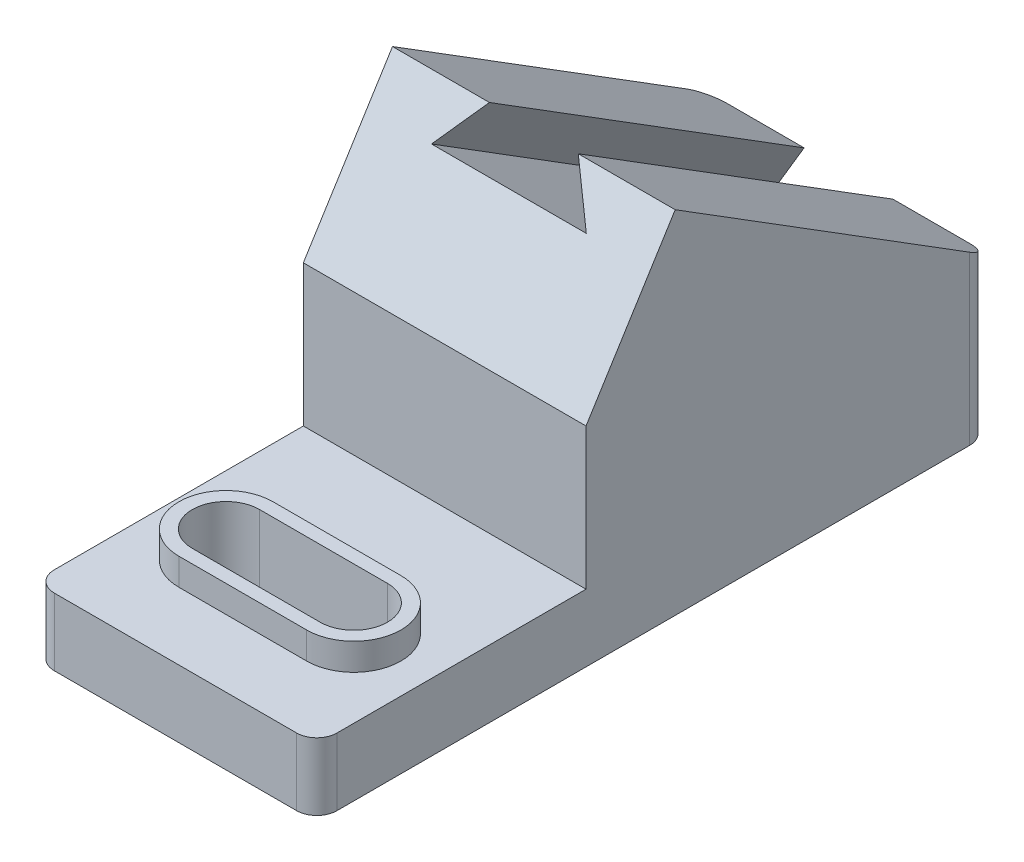
ISO-10303-21;
HEADER;
FILE_DESCRIPTION(('STEP AP214'),'2;1');
FILE_NAME('part.step','',(''),(''),'','','');
FILE_SCHEMA(('AUTOMOTIVE_DESIGN { 1 0 10303 214 1 1 1 1 }'));
ENDSEC;
DATA;
#1=APPLICATION_CONTEXT('core data for automotive mechanical design processes');
#2=APPLICATION_PROTOCOL_DEFINITION('international standard','automotive_design',2000,#1);
#3=PRODUCT_CONTEXT('',#1,'mechanical');
#4=PRODUCT('Part','Part','',(#3));
#5=PRODUCT_RELATED_PRODUCT_CATEGORY('part','',(#4));
#6=PRODUCT_DEFINITION_FORMATION('','',#4);
#7=PRODUCT_DEFINITION_CONTEXT('part definition',#1,'design');
#8=PRODUCT_DEFINITION('design','',#6,#7);
#9=PRODUCT_DEFINITION_SHAPE('','',#8);
#10=(LENGTH_UNIT() NAMED_UNIT(*) SI_UNIT(.MILLI.,.METRE.));
#11=(NAMED_UNIT(*) PLANE_ANGLE_UNIT() SI_UNIT($,.RADIAN.));
#12=(NAMED_UNIT(*) SI_UNIT($,.STERADIAN.) SOLID_ANGLE_UNIT());
#13=UNCERTAINTY_MEASURE_WITH_UNIT(LENGTH_MEASURE(1.E-05),#10,'distance_accuracy_value','');
#14=(GEOMETRIC_REPRESENTATION_CONTEXT(3) GLOBAL_UNCERTAINTY_ASSIGNED_CONTEXT((#13)) GLOBAL_UNIT_ASSIGNED_CONTEXT((#10,
#11,#12)) REPRESENTATION_CONTEXT('',''));
#15=CARTESIAN_POINT('',(0.,0.,0.));
#16=DIRECTION('',(0.,0.,1.));
#17=DIRECTION('',(1.,0.,0.));
#18=AXIS2_PLACEMENT_3D('',#15,#16,#17);
#19=CARTESIAN_POINT('',(21.,22.9872989694927,0.));
#20=DIRECTION('',(0.,-0.848048096156425,0.529919264233206));
#21=DIRECTION('',(0.,-0.529919264233206,-0.848048096156426));
#22=AXIS2_PLACEMENT_3D('',#19,#20,#21);
#23=PLANE('',#22);
#24=DIRECTION('',(-1.,0.,0.));
#25=VECTOR('',#24,1.);
#26=CARTESIAN_POINT('',(21.,22.9872989694927,0.));
#27=LINE('',#26,#25);
#28=CARTESIAN_POINT('',(-6.59854723253198,22.9872989694927,0.));
#29=VERTEX_POINT('',#28);
#30=CARTESIAN_POINT('',(-18.,22.9872989694927,0.));
#31=VERTEX_POINT('',#30);
#32=EDGE_CURVE('E229',#29,#31,#27,.T.);
#33=ORIENTED_EDGE('',*,*,#32,.T.);
#34=CARTESIAN_POINT('',(-18.,24.8619070252207,3.));
#35=DIRECTION('',(0.,-0.848048096156425,0.529919264233206));
#36=DIRECTION('',(0.,0.529919264233206,0.848048096156426));
#37=AXIS2_PLACEMENT_3D('',#34,#35,#36);
#38=ELLIPSE('',#37,3.53753521008629,3.);
#39=CARTESIAN_POINT('',(-21.,24.8619070252207,3.));
#40=VERTEX_POINT('',#39);
#41=EDGE_CURVE('E241',#31,#40,#38,.F.);
#42=ORIENTED_EDGE('',*,*,#41,.T.);
#43=DIRECTION('',(0.,0.529919264233206,0.848048096156426));
#44=VECTOR('',#43,1.);
#45=CARTESIAN_POINT('',(-21.,22.9872989694927,0.));
#46=LINE('',#45,#44);
#47=CARTESIAN_POINT('',(-21.,52.2012024039106,46.7520183941699));
#48=VERTEX_POINT('',#47);
#49=EDGE_CURVE('E222',#40,#48,#46,.T.);
#50=ORIENTED_EDGE('',*,*,#49,.T.);
#51=DIRECTION('',(-1.,0.,0.));
#52=VECTOR('',#51,1.);
#53=CARTESIAN_POINT('',(21.,52.2012024039106,46.7520183941699));
#54=LINE('',#53,#52);
#55=CARTESIAN_POINT('',(-6.59854723253198,52.2012024039107,46.7520183941699));
#56=VERTEX_POINT('',#55);
#57=EDGE_CURVE('E212',#56,#48,#54,.T.);
#58=ORIENTED_EDGE('',*,*,#57,.F.);
#59=DIRECTION('',(0.,0.529919264233205,0.848048096156426));
#60=VECTOR('',#59,1.);
#61=CARTESIAN_POINT('',(-6.59854723253198,7.94684225197886,-24.0697622175849));
#62=LINE('',#61,#60);
#63=EDGE_CURVE('E194',#29,#56,#62,.T.);
#64=ORIENTED_EDGE('',*,*,#63,.F.);
#65=EDGE_LOOP('',(#33,#42,#50,#58,#64));
#66=FACE_BOUND('',#65,.T.);
#67=ADVANCED_FACE('F41',(#66),#23,.F.);
#68=CARTESIAN_POINT('',(21.,0.,0.));
#69=DIRECTION('',(0.,0.,1.));
#70=DIRECTION('',(1.,0.,0.));
#71=AXIS2_PLACEMENT_3D('',#68,#69,#70);
#72=PLANE('',#71);
#73=DIRECTION('',(-1.,0.,0.));
#74=VECTOR('',#73,1.);
#75=CARTESIAN_POINT('',(21.,0.,0.));
#76=LINE('',#75,#74);
#77=CARTESIAN_POINT('',(18.,0.,0.));
#78=VERTEX_POINT('',#77);
#79=CARTESIAN_POINT('',(-18.,0.,0.));
#80=VERTEX_POINT('',#79);
#81=EDGE_CURVE('E232',#78,#80,#76,.T.);
#82=ORIENTED_EDGE('',*,*,#81,.T.);
#83=DIRECTION('',(0.,1.,0.));
#84=VECTOR('',#83,1.);
#85=CARTESIAN_POINT('',(-18.,0.,0.));
#86=LINE('',#85,#84);
#87=EDGE_CURVE('E239',#80,#31,#86,.T.);
#88=ORIENTED_EDGE('',*,*,#87,.T.);
#89=ORIENTED_EDGE('',*,*,#32,.F.);
#90=DIRECTION('',(0.51057668670334,0.85983222025872,0.));
#91=VECTOR('',#90,1.);
#92=CARTESIAN_POINT('',(-18.739073495521,2.54215150454311,0.));
#93=LINE('',#92,#91);
#94=CARTESIAN_POINT('',(-11.5,14.7330501459581,0.));
#95=VERTEX_POINT('',#94);
#96=EDGE_CURVE('E205',#95,#29,#93,.T.);
#97=ORIENTED_EDGE('',*,*,#96,.F.);
#98=DIRECTION('',(-1.,0.,0.));
#99=VECTOR('',#98,1.);
#100=CARTESIAN_POINT('',(0.,14.7330501459581,0.));
#101=LINE('',#100,#99);
#102=CARTESIAN_POINT('',(11.5,14.7330501459581,0.));
#103=VERTEX_POINT('',#102);
#104=EDGE_CURVE('E388',#103,#95,#101,.T.);
#105=ORIENTED_EDGE('',*,*,#104,.F.);
#106=DIRECTION('',(0.51057668670334,-0.85983222025872,0.));
#107=VECTOR('',#106,1.);
#108=CARTESIAN_POINT('',(18.739073495521,2.54215150454312,0.));
#109=LINE('',#108,#107);
#110=CARTESIAN_POINT('',(6.59854723253198,22.9872989694927,0.));
#111=VERTEX_POINT('',#110);
#112=EDGE_CURVE('E385',#111,#103,#109,.T.);
#113=ORIENTED_EDGE('',*,*,#112,.F.);
#114=CARTESIAN_POINT('',(18.,22.9872989694927,0.));
#115=VERTEX_POINT('',#114);
#116=EDGE_CURVE('E235',#115,#111,#27,.T.);
#117=ORIENTED_EDGE('',*,*,#116,.F.);
#118=DIRECTION('',(0.,1.,0.));
#119=VECTOR('',#118,1.);
#120=CARTESIAN_POINT('',(18.,0.,0.));
#121=LINE('',#120,#119);
#122=EDGE_CURVE('E240',#115,#78,#121,.F.);
#123=ORIENTED_EDGE('',*,*,#122,.T.);
#124=EDGE_LOOP('',(#82,#88,#89,#97,#105,#113,#117,#123));
#125=FACE_BOUND('',#124,.T.);
#126=ADVANCED_FACE('F399',(#125),#72,.F.);
#127=CARTESIAN_POINT('',(21.,52.2012024039106,46.7520183941699));
#128=DIRECTION('',(0.,-0.529919264233205,-0.848048096156426));
#129=DIRECTION('',(0.,0.848048096156426,-0.529919264233205));
#130=AXIS2_PLACEMENT_3D('',#127,#128,#129);
#131=PLANE('',#130);
#132=DIRECTION('',(-0.57357643635105,-0.694680331621921,0.434084448604747));
#133=VECTOR('',#132,1.);
#134=CARTESIAN_POINT('',(-13.5870330842894,43.7371802416358,52.0409264372568));
#135=LINE('',#134,#133);
#136=CARTESIAN_POINT('',(-11.5,46.2648657308157,50.4614532438023));
#137=VERTEX_POINT('',#136);
#138=EDGE_CURVE('E200',#56,#137,#135,.T.);
#139=ORIENTED_EDGE('',*,*,#138,.F.);
#140=ORIENTED_EDGE('',*,*,#57,.T.);
#141=DIRECTION('',(0.,-0.848048096156426,0.529919264233205));
#142=VECTOR('',#141,1.);
#143=CARTESIAN_POINT('',(-21.,52.2012024039106,46.7520183941699));
#144=LINE('',#143,#142);
#145=CARTESIAN_POINT('',(-21.,31.,60.));
#146=VERTEX_POINT('',#145);
#147=EDGE_CURVE('E306',#48,#146,#144,.T.);
#148=ORIENTED_EDGE('',*,*,#147,.T.);
#149=DIRECTION('',(-1.,0.,0.));
#150=VECTOR('',#149,1.);
#151=CARTESIAN_POINT('',(21.,31.,60.));
#152=LINE('',#151,#150);
#153=CARTESIAN_POINT('',(21.,31.,60.));
#154=VERTEX_POINT('',#153);
#155=EDGE_CURVE('E224',#154,#146,#152,.T.);
#156=ORIENTED_EDGE('',*,*,#155,.F.);
#157=DIRECTION('',(0.,-0.848048096156426,0.529919264233205));
#158=VECTOR('',#157,1.);
#159=CARTESIAN_POINT('',(21.,52.2012024039106,46.7520183941699));
#160=LINE('',#159,#158);
#161=CARTESIAN_POINT('',(21.,52.2012024039106,46.7520183941699));
#162=VERTEX_POINT('',#161);
#163=EDGE_CURVE('E316',#162,#154,#160,.T.);
#164=ORIENTED_EDGE('',*,*,#163,.F.);
#165=CARTESIAN_POINT('',(6.59854723253198,52.2012024039107,46.7520183941699));
#166=VERTEX_POINT('',#165);
#167=EDGE_CURVE('E225',#162,#166,#54,.T.);
#168=ORIENTED_EDGE('',*,*,#167,.T.);
#169=DIRECTION('',(-0.57357643635105,0.694680331621921,-0.434084448604747));
#170=VECTOR('',#169,1.);
#171=CARTESIAN_POINT('',(13.5870330842894,43.7371802416358,52.0409264372568));
#172=LINE('',#171,#170);
#173=CARTESIAN_POINT('',(11.5,46.2648657308157,50.4614532438023));
#174=VERTEX_POINT('',#173);
#175=EDGE_CURVE('E208',#174,#166,#172,.T.);
#176=ORIENTED_EDGE('',*,*,#175,.F.);
#177=DIRECTION('',(1.,0.,0.));
#178=VECTOR('',#177,1.);
#179=CARTESIAN_POINT('',(0.,46.2648657308157,50.4614532438023));
#180=LINE('',#179,#178);
#181=EDGE_CURVE('E217',#137,#174,#180,.T.);
#182=ORIENTED_EDGE('',*,*,#181,.F.);
#183=EDGE_LOOP('',(#139,#140,#148,#156,#164,#168,#176,#182));
#184=FACE_BOUND('',#183,.T.);
#185=ADVANCED_FACE('F213',(#184),#131,.F.);
#186=CARTESIAN_POINT('',(21.,0.,100.));
#187=DIRECTION('',(0.,1.,0.));
#188=DIRECTION('',(0.,0.,1.));
#189=AXIS2_PLACEMENT_3D('',#186,#187,#188);
#190=PLANE('',#189);
#191=DIRECTION('',(0.,0.,-1.));
#192=VECTOR('',#191,1.);
#193=CARTESIAN_POINT('',(-21.,0.,100.));
#194=LINE('',#193,#192);
#195=CARTESIAN_POINT('',(-21.,0.,97.));
#196=VERTEX_POINT('',#195);
#197=CARTESIAN_POINT('',(-21.,0.,3.));
#198=VERTEX_POINT('',#197);
#199=EDGE_CURVE('E315',#196,#198,#194,.T.);
#200=ORIENTED_EDGE('',*,*,#199,.T.);
#201=CARTESIAN_POINT('',(-18.,0.,3.));
#202=DIRECTION('',(0.,1.,0.));
#203=DIRECTION('',(0.,0.,1.));
#204=AXIS2_PLACEMENT_3D('',#201,#202,#203);
#205=CIRCLE('',#204,3.);
#206=EDGE_CURVE('E255',#198,#80,#205,.F.);
#207=ORIENTED_EDGE('',*,*,#206,.T.);
#208=ORIENTED_EDGE('',*,*,#81,.F.);
#209=CARTESIAN_POINT('',(18.,0.,3.));
#210=DIRECTION('',(0.,1.,0.));
#211=DIRECTION('',(0.,0.,1.));
#212=AXIS2_PLACEMENT_3D('',#209,#210,#211);
#213=CIRCLE('',#212,3.);
#214=CARTESIAN_POINT('',(21.,0.,3.));
#215=VERTEX_POINT('',#214);
#216=EDGE_CURVE('E252',#78,#215,#213,.F.);
#217=ORIENTED_EDGE('',*,*,#216,.T.);
#218=DIRECTION('',(0.,0.,-1.));
#219=VECTOR('',#218,1.);
#220=CARTESIAN_POINT('',(21.,0.,100.));
#221=LINE('',#220,#219);
#222=CARTESIAN_POINT('',(21.,0.,97.));
#223=VERTEX_POINT('',#222);
#224=EDGE_CURVE('E289',#223,#215,#221,.T.);
#225=ORIENTED_EDGE('',*,*,#224,.F.);
#226=CARTESIAN_POINT('',(18.,0.,97.));
#227=DIRECTION('',(0.,1.,0.));
#228=DIRECTION('',(0.,0.,1.));
#229=AXIS2_PLACEMENT_3D('',#226,#227,#228);
#230=CIRCLE('',#229,3.);
#231=CARTESIAN_POINT('',(18.,0.,100.));
#232=VERTEX_POINT('',#231);
#233=EDGE_CURVE('E246',#223,#232,#230,.F.);
#234=ORIENTED_EDGE('',*,*,#233,.T.);
#235=DIRECTION('',(-1.,0.,0.));
#236=VECTOR('',#235,1.);
#237=CARTESIAN_POINT('',(21.,0.,100.));
#238=LINE('',#237,#236);
#239=CARTESIAN_POINT('',(-18.,0.,100.));
#240=VERTEX_POINT('',#239);
#241=EDGE_CURVE('E285',#232,#240,#238,.T.);
#242=ORIENTED_EDGE('',*,*,#241,.T.);
#243=CARTESIAN_POINT('',(-18.,0.,97.));
#244=DIRECTION('',(0.,1.,0.));
#245=DIRECTION('',(0.,0.,1.));
#246=AXIS2_PLACEMENT_3D('',#243,#244,#245);
#247=CIRCLE('',#246,3.);
#248=EDGE_CURVE('E249',#240,#196,#247,.F.);
#249=ORIENTED_EDGE('',*,*,#248,.T.);
#250=EDGE_LOOP('',(#200,#207,#208,#217,#225,#234,#242,#249));
#251=FACE_BOUND('',#250,.T.);
#252=DIRECTION('',(1.,0.,0.));
#253=VECTOR('',#252,1.);
#254=CARTESIAN_POINT('',(0.,0.,78.));
#255=LINE('',#254,#253);
#256=CARTESIAN_POINT('',(-9.5,0.,78.));
#257=VERTEX_POINT('',#256);
#258=CARTESIAN_POINT('',(9.5,0.,78.));
#259=VERTEX_POINT('',#258);
#260=EDGE_CURVE('E377',#257,#259,#255,.T.);
#261=ORIENTED_EDGE('',*,*,#260,.F.);
#262=CARTESIAN_POINT('',(-9.5,0.,83.));
#263=DIRECTION('',(0.,1.,0.));
#264=DIRECTION('',(0.,0.,1.));
#265=AXIS2_PLACEMENT_3D('',#262,#263,#264);
#266=CIRCLE('',#265,5.);
#267=CARTESIAN_POINT('',(-9.5,0.,88.));
#268=VERTEX_POINT('',#267);
#269=EDGE_CURVE('E376',#257,#268,#266,.T.);
#270=ORIENTED_EDGE('',*,*,#269,.T.);
#271=DIRECTION('',(1.,0.,0.));
#272=VECTOR('',#271,1.);
#273=CARTESIAN_POINT('',(0.,0.,88.));
#274=LINE('',#273,#272);
#275=CARTESIAN_POINT('',(9.5,0.,88.));
#276=VERTEX_POINT('',#275);
#277=EDGE_CURVE('E373',#268,#276,#274,.T.);
#278=ORIENTED_EDGE('',*,*,#277,.T.);
#279=CARTESIAN_POINT('',(9.5,0.,83.));
#280=DIRECTION('',(0.,1.,0.));
#281=DIRECTION('',(0.,0.,1.));
#282=AXIS2_PLACEMENT_3D('',#279,#280,#281);
#283=CIRCLE('',#282,5.);
#284=EDGE_CURVE('E354',#276,#259,#283,.T.);
#285=ORIENTED_EDGE('',*,*,#284,.T.);
#286=EDGE_LOOP('',(#261,#270,#278,#285));
#287=FACE_BOUND('',#286,.T.);
#288=ADVANCED_FACE('F286',(#251,#287),#190,.F.);
#289=DIRECTION('',(0.,0.529919264233206,0.848048096156426));
#290=VECTOR('',#289,1.);
#291=CARTESIAN_POINT('',(21.,22.9872989694927,0.));
#292=LINE('',#291,#290);
#293=CARTESIAN_POINT('',(21.,24.8619070252207,3.));
#294=VERTEX_POINT('',#293);
#295=EDGE_CURVE('E308',#294,#162,#292,.T.);
#296=ORIENTED_EDGE('',*,*,#295,.F.);
#297=CARTESIAN_POINT('',(18.,24.8619070252207,3.));
#298=DIRECTION('',(0.,-0.848048096156425,0.529919264233206));
#299=DIRECTION('',(0.,-0.529919264233206,-0.848048096156426));
#300=AXIS2_PLACEMENT_3D('',#297,#298,#299);
#301=ELLIPSE('',#300,3.53753521008629,3.);
#302=EDGE_CURVE('E265',#294,#115,#301,.F.);
#303=ORIENTED_EDGE('',*,*,#302,.T.);
#304=ORIENTED_EDGE('',*,*,#116,.T.);
#305=DIRECTION('',(0.,0.529919264233205,0.848048096156426));
#306=VECTOR('',#305,1.);
#307=CARTESIAN_POINT('',(6.59854723253198,7.94684225197886,-24.0697622175849));
#308=LINE('',#307,#306);
#309=EDGE_CURVE('E390',#111,#166,#308,.T.);
#310=ORIENTED_EDGE('',*,*,#309,.T.);
#311=ORIENTED_EDGE('',*,*,#167,.F.);
#312=EDGE_LOOP('',(#296,#303,#304,#310,#311));
#313=FACE_BOUND('',#312,.T.);
#314=ADVANCED_FACE('F418',(#313),#23,.F.);
#315=CARTESIAN_POINT('',(21.,31.,60.));
#316=DIRECTION('',(0.,0.,-1.));
#317=DIRECTION('',(-1.,0.,0.));
#318=AXIS2_PLACEMENT_3D('',#315,#316,#317);
#319=PLANE('',#318);
#320=DIRECTION('',(0.,-1.,0.));
#321=VECTOR('',#320,1.);
#322=CARTESIAN_POINT('',(-21.,31.,60.));
#323=LINE('',#322,#321);
#324=CARTESIAN_POINT('',(-21.,10.,60.));
#325=VERTEX_POINT('',#324);
#326=EDGE_CURVE('E301',#146,#325,#323,.T.);
#327=ORIENTED_EDGE('',*,*,#326,.T.);
#328=DIRECTION('',(-1.,0.,0.));
#329=VECTOR('',#328,1.);
#330=CARTESIAN_POINT('',(21.,10.,60.));
#331=LINE('',#330,#329);
#332=CARTESIAN_POINT('',(21.,10.,60.));
#333=VERTEX_POINT('',#332);
#334=EDGE_CURVE('E230',#333,#325,#331,.T.);
#335=ORIENTED_EDGE('',*,*,#334,.F.);
#336=DIRECTION('',(0.,-1.,0.));
#337=VECTOR('',#336,1.);
#338=CARTESIAN_POINT('',(21.,31.,60.));
#339=LINE('',#338,#337);
#340=EDGE_CURVE('E284',#154,#333,#339,.T.);
#341=ORIENTED_EDGE('',*,*,#340,.F.);
#342=ORIENTED_EDGE('',*,*,#155,.T.);
#343=EDGE_LOOP('',(#327,#335,#341,#342));
#344=FACE_BOUND('',#343,.T.);
#345=ADVANCED_FACE('F419',(#344),#319,.F.);
#346=CARTESIAN_POINT('',(21.,10.,60.));
#347=DIRECTION('',(0.,-1.,0.));
#348=DIRECTION('',(0.,0.,-1.));
#349=AXIS2_PLACEMENT_3D('',#346,#347,#348);
#350=PLANE('',#349);
#351=DIRECTION('',(1.,0.,0.));
#352=VECTOR('',#351,1.);
#353=CARTESIAN_POINT('',(0.,9.99999999999999,90.));
#354=LINE('',#353,#352);
#355=CARTESIAN_POINT('',(-9.5,9.99999999999999,90.));
#356=VERTEX_POINT('',#355);
#357=CARTESIAN_POINT('',(9.5,10.,90.));
#358=VERTEX_POINT('',#357);
#359=EDGE_CURVE('E346',#356,#358,#354,.T.);
#360=ORIENTED_EDGE('',*,*,#359,.F.);
#361=CARTESIAN_POINT('',(-9.5,9.99999999999999,83.));
#362=DIRECTION('',(0.,1.,0.));
#363=DIRECTION('',(0.,0.,1.));
#364=AXIS2_PLACEMENT_3D('',#361,#362,#363);
#365=CIRCLE('',#364,7.00000000000001);
#366=CARTESIAN_POINT('',(-9.5,10.,76.));
#367=VERTEX_POINT('',#366);
#368=EDGE_CURVE('E338',#367,#356,#365,.T.);
#369=ORIENTED_EDGE('',*,*,#368,.F.);
#370=DIRECTION('',(1.,0.,0.));
#371=VECTOR('',#370,1.);
#372=CARTESIAN_POINT('',(0.,10.,76.));
#373=LINE('',#372,#371);
#374=CARTESIAN_POINT('',(9.5,10.,76.));
#375=VERTEX_POINT('',#374);
#376=EDGE_CURVE('E341',#367,#375,#373,.T.);
#377=ORIENTED_EDGE('',*,*,#376,.T.);
#378=CARTESIAN_POINT('',(9.5,9.99999999999999,83.));
#379=DIRECTION('',(0.,1.,0.));
#380=DIRECTION('',(0.,0.,1.));
#381=AXIS2_PLACEMENT_3D('',#378,#379,#380);
#382=CIRCLE('',#381,7.00000000000001);
#383=EDGE_CURVE('E344',#358,#375,#382,.T.);
#384=ORIENTED_EDGE('',*,*,#383,.F.);
#385=EDGE_LOOP('',(#360,#369,#377,#384));
#386=FACE_BOUND('',#385,.T.);
#387=DIRECTION('',(0.,0.,1.));
#388=VECTOR('',#387,1.);
#389=CARTESIAN_POINT('',(-21.,10.,60.));
#390=LINE('',#389,#388);
#391=CARTESIAN_POINT('',(-21.,9.99999999999999,97.));
#392=VERTEX_POINT('',#391);
#393=EDGE_CURVE('E299',#325,#392,#390,.T.);
#394=ORIENTED_EDGE('',*,*,#393,.T.);
#395=CARTESIAN_POINT('',(-18.,9.99999999999999,97.));
#396=DIRECTION('',(0.,-1.,0.));
#397=DIRECTION('',(0.,0.,-1.));
#398=AXIS2_PLACEMENT_3D('',#395,#396,#397);
#399=CIRCLE('',#398,3.);
#400=CARTESIAN_POINT('',(-18.,9.99999999999999,100.));
#401=VERTEX_POINT('',#400);
#402=EDGE_CURVE('E11',#392,#401,#399,.F.);
#403=ORIENTED_EDGE('',*,*,#402,.T.);
#404=DIRECTION('',(-1.,0.,0.));
#405=VECTOR('',#404,1.);
#406=CARTESIAN_POINT('',(21.,9.99999999999999,100.));
#407=LINE('',#406,#405);
#408=CARTESIAN_POINT('',(18.,9.99999999999999,100.));
#409=VERTEX_POINT('',#408);
#410=EDGE_CURVE('E272',#409,#401,#407,.T.);
#411=ORIENTED_EDGE('',*,*,#410,.F.);
#412=CARTESIAN_POINT('',(18.,9.99999999999999,97.));
#413=DIRECTION('',(0.,-1.,0.));
#414=DIRECTION('',(0.,0.,-1.));
#415=AXIS2_PLACEMENT_3D('',#412,#413,#414);
#416=CIRCLE('',#415,3.);
#417=CARTESIAN_POINT('',(21.,9.99999999999999,97.));
#418=VERTEX_POINT('',#417);
#419=EDGE_CURVE('E47',#409,#418,#416,.F.);
#420=ORIENTED_EDGE('',*,*,#419,.T.);
#421=DIRECTION('',(0.,0.,1.));
#422=VECTOR('',#421,1.);
#423=CARTESIAN_POINT('',(21.,10.,60.));
#424=LINE('',#423,#422);
#425=EDGE_CURVE('E275',#333,#418,#424,.T.);
#426=ORIENTED_EDGE('',*,*,#425,.F.);
#427=ORIENTED_EDGE('',*,*,#334,.T.);
#428=EDGE_LOOP('',(#394,#403,#411,#420,#426,#427));
#429=FACE_BOUND('',#428,.T.);
#430=ADVANCED_FACE('F269',(#386,#429),#350,.F.);
#431=CARTESIAN_POINT('',(21.,9.99999999999999,100.));
#432=DIRECTION('',(0.,0.,-1.));
#433=DIRECTION('',(-1.,0.,0.));
#434=AXIS2_PLACEMENT_3D('',#431,#432,#433);
#435=PLANE('',#434);
#436=ORIENTED_EDGE('',*,*,#410,.T.);
#437=DIRECTION('',(0.,-1.,0.));
#438=VECTOR('',#437,1.);
#439=CARTESIAN_POINT('',(-18.,9.99999999999999,100.));
#440=LINE('',#439,#438);
#441=EDGE_CURVE('E264',#401,#240,#440,.T.);
#442=ORIENTED_EDGE('',*,*,#441,.T.);
#443=ORIENTED_EDGE('',*,*,#241,.F.);
#444=DIRECTION('',(0.,-1.,0.));
#445=VECTOR('',#444,1.);
#446=CARTESIAN_POINT('',(18.,9.99999999999999,100.));
#447=LINE('',#446,#445);
#448=EDGE_CURVE('E64',#232,#409,#447,.F.);
#449=ORIENTED_EDGE('',*,*,#448,.T.);
#450=EDGE_LOOP('',(#436,#442,#443,#449));
#451=FACE_BOUND('',#450,.T.);
#452=ADVANCED_FACE('F292',(#451),#435,.F.);
#453=CARTESIAN_POINT('',(21.,0.,0.));
#454=DIRECTION('',(1.,0.,0.));
#455=DIRECTION('',(0.,0.,-1.));
#456=AXIS2_PLACEMENT_3D('',#453,#454,#455);
#457=PLANE('',#456);
#458=ORIENTED_EDGE('',*,*,#224,.T.);
#459=DIRECTION('',(0.,1.,0.));
#460=VECTOR('',#459,1.);
#461=CARTESIAN_POINT('',(21.,22.9872989694927,3.));
#462=LINE('',#461,#460);
#463=EDGE_CURVE('E259',#215,#294,#462,.T.);
#464=ORIENTED_EDGE('',*,*,#463,.T.);
#465=ORIENTED_EDGE('',*,*,#295,.T.);
#466=ORIENTED_EDGE('',*,*,#163,.T.);
#467=ORIENTED_EDGE('',*,*,#340,.T.);
#468=ORIENTED_EDGE('',*,*,#425,.T.);
#469=DIRECTION('',(0.,-1.,0.));
#470=VECTOR('',#469,1.);
#471=CARTESIAN_POINT('',(21.,0.,97.));
#472=LINE('',#471,#470);
#473=EDGE_CURVE('E258',#418,#223,#472,.T.);
#474=ORIENTED_EDGE('',*,*,#473,.T.);
#475=EDGE_LOOP('',(#458,#464,#465,#466,#467,#468,#474));
#476=FACE_BOUND('',#475,.T.);
#477=ADVANCED_FACE('F279',(#476),#457,.T.);
#478=CARTESIAN_POINT('',(-21.,0.,0.));
#479=DIRECTION('',(1.,0.,0.));
#480=DIRECTION('',(0.,0.,-1.));
#481=AXIS2_PLACEMENT_3D('',#478,#479,#480);
#482=PLANE('',#481);
#483=ORIENTED_EDGE('',*,*,#49,.F.);
#484=DIRECTION('',(0.,1.,0.));
#485=VECTOR('',#484,1.);
#486=CARTESIAN_POINT('',(-21.,0.,3.));
#487=LINE('',#486,#485);
#488=EDGE_CURVE('E248',#40,#198,#487,.F.);
#489=ORIENTED_EDGE('',*,*,#488,.T.);
#490=ORIENTED_EDGE('',*,*,#199,.F.);
#491=DIRECTION('',(0.,-1.,0.));
#492=VECTOR('',#491,1.);
#493=CARTESIAN_POINT('',(-21.,0.,97.));
#494=LINE('',#493,#492);
#495=EDGE_CURVE('E243',#196,#392,#494,.F.);
#496=ORIENTED_EDGE('',*,*,#495,.T.);
#497=ORIENTED_EDGE('',*,*,#393,.F.);
#498=ORIENTED_EDGE('',*,*,#326,.F.);
#499=ORIENTED_EDGE('',*,*,#147,.F.);
#500=EDGE_LOOP('',(#483,#489,#490,#496,#497,#498,#499));
#501=FACE_BOUND('',#500,.T.);
#502=ADVANCED_FACE('F305',(#501),#482,.F.);
#503=CARTESIAN_POINT('',(0.,14.,90.));
#504=DIRECTION('',(0.,0.,-1.));
#505=DIRECTION('',(0.,1.,0.));
#506=AXIS2_PLACEMENT_3D('',#503,#504,#505);
#507=PLANE('',#506);
#508=ORIENTED_EDGE('',*,*,#359,.T.);
#509=DIRECTION('',(0.,-1.,0.));
#510=VECTOR('',#509,1.);
#511=CARTESIAN_POINT('',(9.5,14.,90.));
#512=LINE('',#511,#510);
#513=CARTESIAN_POINT('',(9.5,14.,90.));
#514=VERTEX_POINT('',#513);
#515=EDGE_CURVE('E311',#514,#358,#512,.T.);
#516=ORIENTED_EDGE('',*,*,#515,.F.);
#517=DIRECTION('',(1.,0.,0.));
#518=VECTOR('',#517,1.);
#519=CARTESIAN_POINT('',(0.,14.,90.));
#520=LINE('',#519,#518);
#521=CARTESIAN_POINT('',(-9.5,14.,90.));
#522=VERTEX_POINT('',#521);
#523=EDGE_CURVE('E356',#522,#514,#520,.T.);
#524=ORIENTED_EDGE('',*,*,#523,.F.);
#525=DIRECTION('',(0.,-1.,0.));
#526=VECTOR('',#525,1.);
#527=CARTESIAN_POINT('',(-9.5,14.,90.));
#528=LINE('',#527,#526);
#529=EDGE_CURVE('E321',#522,#356,#528,.T.);
#530=ORIENTED_EDGE('',*,*,#529,.T.);
#531=EDGE_LOOP('',(#508,#516,#524,#530));
#532=FACE_BOUND('',#531,.T.);
#533=ADVANCED_FACE('F597',(#532),#507,.F.);
#534=CARTESIAN_POINT('',(9.5,14.,83.));
#535=DIRECTION('',(0.,-1.,0.));
#536=DIRECTION('',(0.,0.,-1.));
#537=AXIS2_PLACEMENT_3D('',#534,#535,#536);
#538=CYLINDRICAL_SURFACE('',#537,7.00000000000001);
#539=ORIENTED_EDGE('',*,*,#383,.T.);
#540=DIRECTION('',(0.,-1.,0.));
#541=VECTOR('',#540,1.);
#542=CARTESIAN_POINT('',(9.5,14.,76.));
#543=LINE('',#542,#541);
#544=CARTESIAN_POINT('',(9.5,14.,76.));
#545=VERTEX_POINT('',#544);
#546=EDGE_CURVE('E332',#545,#375,#543,.T.);
#547=ORIENTED_EDGE('',*,*,#546,.F.);
#548=CARTESIAN_POINT('',(9.5,14.,83.));
#549=DIRECTION('',(0.,1.,0.));
#550=DIRECTION('',(0.,0.,1.));
#551=AXIS2_PLACEMENT_3D('',#548,#549,#550);
#552=CIRCLE('',#551,7.00000000000001);
#553=EDGE_CURVE('E358',#514,#545,#552,.T.);
#554=ORIENTED_EDGE('',*,*,#553,.F.);
#555=ORIENTED_EDGE('',*,*,#515,.T.);
#556=EDGE_LOOP('',(#539,#547,#554,#555));
#557=FACE_BOUND('',#556,.T.);
#558=ADVANCED_FACE('F591',(#557),#538,.T.);
#559=CARTESIAN_POINT('',(0.,14.,76.));
#560=DIRECTION('',(0.,0.,-1.));
#561=DIRECTION('',(0.,1.,0.));
#562=AXIS2_PLACEMENT_3D('',#559,#560,#561);
#563=PLANE('',#562);
#564=ORIENTED_EDGE('',*,*,#376,.F.);
#565=DIRECTION('',(0.,-1.,0.));
#566=VECTOR('',#565,1.);
#567=CARTESIAN_POINT('',(-9.5,14.,76.));
#568=LINE('',#567,#566);
#569=CARTESIAN_POINT('',(-9.5,14.,76.));
#570=VERTEX_POINT('',#569);
#571=EDGE_CURVE('E331',#570,#367,#568,.T.);
#572=ORIENTED_EDGE('',*,*,#571,.F.);
#573=DIRECTION('',(1.,0.,0.));
#574=VECTOR('',#573,1.);
#575=CARTESIAN_POINT('',(0.,14.,76.));
#576=LINE('',#575,#574);
#577=EDGE_CURVE('E355',#570,#545,#576,.T.);
#578=ORIENTED_EDGE('',*,*,#577,.T.);
#579=ORIENTED_EDGE('',*,*,#546,.T.);
#580=EDGE_LOOP('',(#564,#572,#578,#579));
#581=FACE_BOUND('',#580,.T.);
#582=ADVANCED_FACE('F557',(#581),#563,.T.);
#583=CARTESIAN_POINT('',(-9.5,14.,83.));
#584=DIRECTION('',(0.,-1.,0.));
#585=DIRECTION('',(0.,0.,-1.));
#586=AXIS2_PLACEMENT_3D('',#583,#584,#585);
#587=CYLINDRICAL_SURFACE('',#586,5.);
#588=DIRECTION('',(0.,-1.,0.));
#589=VECTOR('',#588,1.);
#590=CARTESIAN_POINT('',(-9.5,14.,88.));
#591=LINE('',#590,#589);
#592=CARTESIAN_POINT('',(-9.5,14.,88.));
#593=VERTEX_POINT('',#592);
#594=EDGE_CURVE('E326',#593,#268,#591,.T.);
#595=ORIENTED_EDGE('',*,*,#594,.T.);
#596=ORIENTED_EDGE('',*,*,#269,.F.);
#597=DIRECTION('',(0.,-1.,0.));
#598=VECTOR('',#597,1.);
#599=CARTESIAN_POINT('',(-9.5,14.,78.));
#600=LINE('',#599,#598);
#601=CARTESIAN_POINT('',(-9.5,14.,78.));
#602=VERTEX_POINT('',#601);
#603=EDGE_CURVE('E317',#602,#257,#600,.T.);
#604=ORIENTED_EDGE('',*,*,#603,.F.);
#605=CARTESIAN_POINT('',(-9.5,14.,83.));
#606=DIRECTION('',(0.,1.,0.));
#607=DIRECTION('',(0.,0.,1.));
#608=AXIS2_PLACEMENT_3D('',#605,#606,#607);
#609=CIRCLE('',#608,5.);
#610=EDGE_CURVE('E345',#602,#593,#609,.T.);
#611=ORIENTED_EDGE('',*,*,#610,.T.);
#612=EDGE_LOOP('',(#595,#596,#604,#611));
#613=FACE_BOUND('',#612,.T.);
#614=ADVANCED_FACE('F547',(#613),#587,.F.);
#615=CARTESIAN_POINT('',(0.,14.,78.));
#616=DIRECTION('',(0.,0.,-1.));
#617=DIRECTION('',(0.,1.,0.));
#618=AXIS2_PLACEMENT_3D('',#615,#616,#617);
#619=PLANE('',#618);
#620=ORIENTED_EDGE('',*,*,#603,.T.);
#621=ORIENTED_EDGE('',*,*,#260,.T.);
#622=DIRECTION('',(0.,-1.,0.));
#623=VECTOR('',#622,1.);
#624=CARTESIAN_POINT('',(9.5,14.,78.));
#625=LINE('',#624,#623);
#626=CARTESIAN_POINT('',(9.5,14.,78.));
#627=VERTEX_POINT('',#626);
#628=EDGE_CURVE('E325',#627,#259,#625,.T.);
#629=ORIENTED_EDGE('',*,*,#628,.F.);
#630=DIRECTION('',(1.,0.,0.));
#631=VECTOR('',#630,1.);
#632=CARTESIAN_POINT('',(0.,14.,78.));
#633=LINE('',#632,#631);
#634=EDGE_CURVE('E370',#602,#627,#633,.T.);
#635=ORIENTED_EDGE('',*,*,#634,.F.);
#636=EDGE_LOOP('',(#620,#621,#629,#635));
#637=FACE_BOUND('',#636,.T.);
#638=ADVANCED_FACE('F536',(#637),#619,.F.);
#639=CARTESIAN_POINT('',(9.5,14.,83.));
#640=DIRECTION('',(0.,-1.,0.));
#641=DIRECTION('',(0.,0.,-1.));
#642=AXIS2_PLACEMENT_3D('',#639,#640,#641);
#643=CYLINDRICAL_SURFACE('',#642,5.);
#644=ORIENTED_EDGE('',*,*,#628,.T.);
#645=ORIENTED_EDGE('',*,*,#284,.F.);
#646=DIRECTION('',(0.,-1.,0.));
#647=VECTOR('',#646,1.);
#648=CARTESIAN_POINT('',(9.5,14.,88.));
#649=LINE('',#648,#647);
#650=CARTESIAN_POINT('',(9.5,14.,88.));
#651=VERTEX_POINT('',#650);
#652=EDGE_CURVE('E322',#651,#276,#649,.T.);
#653=ORIENTED_EDGE('',*,*,#652,.F.);
#654=CARTESIAN_POINT('',(9.5,14.,83.));
#655=DIRECTION('',(0.,1.,0.));
#656=DIRECTION('',(0.,0.,1.));
#657=AXIS2_PLACEMENT_3D('',#654,#655,#656);
#658=CIRCLE('',#657,5.);
#659=EDGE_CURVE('E365',#651,#627,#658,.T.);
#660=ORIENTED_EDGE('',*,*,#659,.T.);
#661=EDGE_LOOP('',(#644,#645,#653,#660));
#662=FACE_BOUND('',#661,.T.);
#663=ADVANCED_FACE('F521',(#662),#643,.F.);
#664=CARTESIAN_POINT('',(0.,14.,88.));
#665=DIRECTION('',(0.,0.,-1.));
#666=DIRECTION('',(0.,1.,0.));
#667=AXIS2_PLACEMENT_3D('',#664,#665,#666);
#668=PLANE('',#667);
#669=ORIENTED_EDGE('',*,*,#652,.T.);
#670=ORIENTED_EDGE('',*,*,#277,.F.);
#671=ORIENTED_EDGE('',*,*,#594,.F.);
#672=DIRECTION('',(1.,0.,0.));
#673=VECTOR('',#672,1.);
#674=CARTESIAN_POINT('',(0.,14.,88.));
#675=LINE('',#674,#673);
#676=EDGE_CURVE('E363',#593,#651,#675,.T.);
#677=ORIENTED_EDGE('',*,*,#676,.T.);
#678=EDGE_LOOP('',(#669,#670,#671,#677));
#679=FACE_BOUND('',#678,.T.);
#680=ADVANCED_FACE('F519',(#679),#668,.T.);
#681=CARTESIAN_POINT('',(-9.5,14.,83.));
#682=DIRECTION('',(0.,-1.,0.));
#683=DIRECTION('',(0.,0.,-1.));
#684=AXIS2_PLACEMENT_3D('',#681,#682,#683);
#685=CYLINDRICAL_SURFACE('',#684,7.00000000000001);
#686=ORIENTED_EDGE('',*,*,#368,.T.);
#687=ORIENTED_EDGE('',*,*,#529,.F.);
#688=CARTESIAN_POINT('',(-9.5,14.,83.));
#689=DIRECTION('',(0.,1.,0.));
#690=DIRECTION('',(0.,0.,1.));
#691=AXIS2_PLACEMENT_3D('',#688,#689,#690);
#692=CIRCLE('',#691,7.00000000000001);
#693=EDGE_CURVE('E327',#570,#522,#692,.T.);
#694=ORIENTED_EDGE('',*,*,#693,.F.);
#695=ORIENTED_EDGE('',*,*,#571,.T.);
#696=EDGE_LOOP('',(#686,#687,#694,#695));
#697=FACE_BOUND('',#696,.T.);
#698=ADVANCED_FACE('F525',(#697),#685,.T.);
#699=CARTESIAN_POINT('',(0.,14.,0.));
#700=DIRECTION('',(0.,1.,0.));
#701=DIRECTION('',(0.,0.,1.));
#702=AXIS2_PLACEMENT_3D('',#699,#700,#701);
#703=PLANE('',#702);
#704=ORIENTED_EDGE('',*,*,#610,.F.);
#705=ORIENTED_EDGE('',*,*,#634,.T.);
#706=ORIENTED_EDGE('',*,*,#659,.F.);
#707=ORIENTED_EDGE('',*,*,#676,.F.);
#708=EDGE_LOOP('',(#704,#705,#706,#707));
#709=FACE_BOUND('',#708,.T.);
#710=ORIENTED_EDGE('',*,*,#523,.T.);
#711=ORIENTED_EDGE('',*,*,#553,.T.);
#712=ORIENTED_EDGE('',*,*,#577,.F.);
#713=ORIENTED_EDGE('',*,*,#693,.T.);
#714=EDGE_LOOP('',(#710,#711,#712,#713));
#715=FACE_BOUND('',#714,.T.);
#716=ADVANCED_FACE('F493',(#709,#715),#703,.T.);
#717=CARTESIAN_POINT('',(13.5870330842894,-0.517179910296005,-18.780854174498));
#718=DIRECTION('',(0.819152044288989,0.486420404847696,-0.303949203132653));
#719=DIRECTION('',(-0.51057668670334,0.85983222025872,0.));
#720=AXIS2_PLACEMENT_3D('',#717,#718,#719);
#721=PLANE('',#720);
#722=ORIENTED_EDGE('',*,*,#112,.T.);
#723=DIRECTION('',(0.,0.529919264233205,0.848048096156426));
#724=VECTOR('',#723,1.);
#725=CARTESIAN_POINT('',(11.5,2.01050557888387,-20.3603273679524));
#726=LINE('',#725,#724);
#727=EDGE_CURVE('E384',#103,#174,#726,.T.);
#728=ORIENTED_EDGE('',*,*,#727,.T.);
#729=ORIENTED_EDGE('',*,*,#175,.T.);
#730=ORIENTED_EDGE('',*,*,#309,.F.);
#731=EDGE_LOOP('',(#722,#728,#729,#730));
#732=FACE_BOUND('',#731,.T.);
#733=ADVANCED_FACE('F486',(#732),#721,.F.);
#734=CARTESIAN_POINT('',(0.,2.01050557888387,-20.3603273679524));
#735=DIRECTION('',(0.,-0.848048096156426,0.529919264233205));
#736=DIRECTION('',(0.,-0.529919264233205,-0.848048096156426));
#737=AXIS2_PLACEMENT_3D('',#734,#735,#736);
#738=PLANE('',#737);
#739=ORIENTED_EDGE('',*,*,#104,.T.);
#740=DIRECTION('',(0.,0.529919264233205,0.848048096156426));
#741=VECTOR('',#740,1.);
#742=CARTESIAN_POINT('',(-11.5,2.01050557888387,-20.3603273679524));
#743=LINE('',#742,#741);
#744=EDGE_CURVE('E210',#95,#137,#743,.T.);
#745=ORIENTED_EDGE('',*,*,#744,.T.);
#746=ORIENTED_EDGE('',*,*,#181,.T.);
#747=ORIENTED_EDGE('',*,*,#727,.F.);
#748=EDGE_LOOP('',(#739,#745,#746,#747));
#749=FACE_BOUND('',#748,.T.);
#750=ADVANCED_FACE('F400',(#749),#738,.F.);
#751=CARTESIAN_POINT('',(-13.5870330842894,-0.517179910296012,-18.780854174498));
#752=DIRECTION('',(-0.819152044288989,0.486420404847696,-0.303949203132652));
#753=DIRECTION('',(-0.51057668670334,-0.85983222025872,0.));
#754=AXIS2_PLACEMENT_3D('',#751,#752,#753);
#755=PLANE('',#754);
#756=ORIENTED_EDGE('',*,*,#96,.T.);
#757=ORIENTED_EDGE('',*,*,#63,.T.);
#758=ORIENTED_EDGE('',*,*,#138,.T.);
#759=ORIENTED_EDGE('',*,*,#744,.F.);
#760=EDGE_LOOP('',(#756,#757,#758,#759));
#761=FACE_BOUND('',#760,.T.);
#762=ADVANCED_FACE('F197',(#761),#755,.F.);
#763=CARTESIAN_POINT('',(-18.,0.,3.));
#764=DIRECTION('',(0.,1.,0.));
#765=DIRECTION('',(0.,0.,1.));
#766=AXIS2_PLACEMENT_3D('',#763,#764,#765);
#767=CYLINDRICAL_SURFACE('',#766,3.);
#768=ORIENTED_EDGE('',*,*,#206,.F.);
#769=ORIENTED_EDGE('',*,*,#488,.F.);
#770=ORIENTED_EDGE('',*,*,#41,.F.);
#771=ORIENTED_EDGE('',*,*,#87,.F.);
#772=EDGE_LOOP('',(#768,#769,#770,#771));
#773=FACE_BOUND('',#772,.T.);
#774=ADVANCED_FACE('F403',(#773),#767,.T.);
#775=CARTESIAN_POINT('',(18.,0.,3.));
#776=DIRECTION('',(0.,-1.,0.));
#777=DIRECTION('',(0.,0.,-1.));
#778=AXIS2_PLACEMENT_3D('',#775,#776,#777);
#779=CYLINDRICAL_SURFACE('',#778,3.);
#780=ORIENTED_EDGE('',*,*,#216,.F.);
#781=ORIENTED_EDGE('',*,*,#122,.F.);
#782=ORIENTED_EDGE('',*,*,#302,.F.);
#783=ORIENTED_EDGE('',*,*,#463,.F.);
#784=EDGE_LOOP('',(#780,#781,#782,#783));
#785=FACE_BOUND('',#784,.T.);
#786=ADVANCED_FACE('F413',(#785),#779,.T.);
#787=CARTESIAN_POINT('',(-18.,9.99999999999999,97.));
#788=DIRECTION('',(0.,-1.,0.));
#789=DIRECTION('',(0.,0.,-1.));
#790=AXIS2_PLACEMENT_3D('',#787,#788,#789);
#791=CYLINDRICAL_SURFACE('',#790,3.);
#792=ORIENTED_EDGE('',*,*,#402,.F.);
#793=ORIENTED_EDGE('',*,*,#495,.F.);
#794=ORIENTED_EDGE('',*,*,#248,.F.);
#795=ORIENTED_EDGE('',*,*,#441,.F.);
#796=EDGE_LOOP('',(#792,#793,#794,#795));
#797=FACE_BOUND('',#796,.T.);
#798=ADVANCED_FACE('F441',(#797),#791,.T.);
#799=CARTESIAN_POINT('',(18.,0.,97.));
#800=DIRECTION('',(0.,1.,0.));
#801=DIRECTION('',(0.,0.,1.));
#802=AXIS2_PLACEMENT_3D('',#799,#800,#801);
#803=CYLINDRICAL_SURFACE('',#802,3.);
#804=ORIENTED_EDGE('',*,*,#419,.F.);
#805=ORIENTED_EDGE('',*,*,#448,.F.);
#806=ORIENTED_EDGE('',*,*,#233,.F.);
#807=ORIENTED_EDGE('',*,*,#473,.F.);
#808=EDGE_LOOP('',(#804,#805,#806,#807));
#809=FACE_BOUND('',#808,.T.);
#810=ADVANCED_FACE('F43',(#809),#803,.T.);
#811=CLOSED_SHELL('',(#67,#126,#185,#288,#314,#345,#430,#452,#477,#502,#533,#558,#582,#614,#638,
#663,#680,#698,#716,#733,#750,#762,#774,#786,#798,#810));
#812=MANIFOLD_SOLID_BREP('B2',#811);
#813=ADVANCED_BREP_SHAPE_REPRESENTATION('',(#18,#812),#14);
#814=SHAPE_DEFINITION_REPRESENTATION(#9,#813);
ENDSEC;
END-ISO-10303-21;
